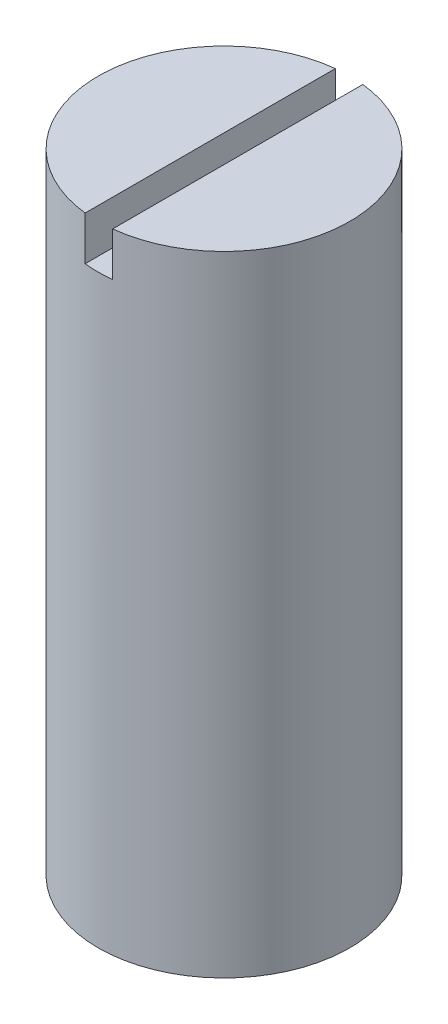
ISO-10303-21;
HEADER;
FILE_DESCRIPTION(('STEP AP214'),'2;1');
FILE_NAME('part.step','',(''),(''),'','','');
FILE_SCHEMA(('AUTOMOTIVE_DESIGN { 1 0 10303 214 1 1 1 1 }'));
ENDSEC;
DATA;
#1=APPLICATION_CONTEXT('core data for automotive mechanical design processes');
#2=APPLICATION_PROTOCOL_DEFINITION('international standard','automotive_design',2000,#1);
#3=PRODUCT_CONTEXT('',#1,'mechanical');
#4=PRODUCT('Part','Part','',(#3));
#5=PRODUCT_RELATED_PRODUCT_CATEGORY('part','',(#4));
#6=PRODUCT_DEFINITION_FORMATION('','',#4);
#7=PRODUCT_DEFINITION_CONTEXT('part definition',#1,'design');
#8=PRODUCT_DEFINITION('design','',#6,#7);
#9=PRODUCT_DEFINITION_SHAPE('','',#8);
#10=(LENGTH_UNIT() NAMED_UNIT(*) SI_UNIT(.MILLI.,.METRE.));
#11=(NAMED_UNIT(*) PLANE_ANGLE_UNIT() SI_UNIT($,.RADIAN.));
#12=(NAMED_UNIT(*) SI_UNIT($,.STERADIAN.) SOLID_ANGLE_UNIT());
#13=UNCERTAINTY_MEASURE_WITH_UNIT(LENGTH_MEASURE(1.E-05),#10,'distance_accuracy_value','');
#14=(GEOMETRIC_REPRESENTATION_CONTEXT(3) GLOBAL_UNCERTAINTY_ASSIGNED_CONTEXT((#13)) GLOBAL_UNIT_ASSIGNED_CONTEXT((#10,
#11,#12)) REPRESENTATION_CONTEXT('',''));
#15=CARTESIAN_POINT('',(0.,0.,0.));
#16=DIRECTION('',(0.,0.,1.));
#17=DIRECTION('',(1.,0.,0.));
#18=AXIS2_PLACEMENT_3D('',#15,#16,#17);
#19=CARTESIAN_POINT('',(0.,80.,0.));
#20=DIRECTION('',(0.,1.,0.));
#21=DIRECTION('',(0.,0.,1.));
#22=AXIS2_PLACEMENT_3D('',#19,#20,#21);
#23=PLANE('',#22);
#24=DIRECTION('',(0.,0.,1.));
#25=VECTOR('',#24,1.);
#26=CARTESIAN_POINT('',(-1.75,80.,0.));
#27=LINE('',#26,#25);
#28=CARTESIAN_POINT('',(-1.75,80.,-15.9040089285689));
#29=VERTEX_POINT('',#28);
#30=CARTESIAN_POINT('',(-1.75,80.,15.9040089285689));
#31=VERTEX_POINT('',#30);
#32=EDGE_CURVE('E65',#29,#31,#27,.T.);
#33=ORIENTED_EDGE('',*,*,#32,.F.);
#34=CARTESIAN_POINT('',(0.,80.,0.));
#35=DIRECTION('',(0.,1.,0.));
#36=DIRECTION('',(0.,0.,1.));
#37=AXIS2_PLACEMENT_3D('',#34,#35,#36);
#38=CIRCLE('',#37,16.);
#39=EDGE_CURVE('E110',#29,#31,#38,.T.);
#40=ORIENTED_EDGE('',*,*,#39,.T.);
#41=EDGE_LOOP('',(#33,#40));
#42=FACE_BOUND('',#41,.T.);
#43=ADVANCED_FACE('F41',(#42),#23,.T.);
#44=CARTESIAN_POINT('',(0.,80.,0.));
#45=DIRECTION('',(0.,-1.,0.));
#46=DIRECTION('',(0.,0.,-1.));
#47=AXIS2_PLACEMENT_3D('',#44,#45,#46);
#48=CYLINDRICAL_SURFACE('',#47,16.);
#49=CARTESIAN_POINT('',(0.,74.4125,0.));
#50=DIRECTION('',(0.,-1.,0.));
#51=DIRECTION('',(0.,0.,-1.));
#52=AXIS2_PLACEMENT_3D('',#49,#50,#51);
#53=CIRCLE('',#52,16.);
#54=CARTESIAN_POINT('',(1.75,74.4125,15.9040089285689));
#55=VERTEX_POINT('',#54);
#56=CARTESIAN_POINT('',(-1.75,74.4125,15.9040089285689));
#57=VERTEX_POINT('',#56);
#58=EDGE_CURVE('E11',#55,#57,#53,.T.);
#59=ORIENTED_EDGE('',*,*,#58,.T.);
#60=DIRECTION('',(0.,-1.,0.));
#61=VECTOR('',#60,1.);
#62=CARTESIAN_POINT('',(-1.75,80.,15.9040089285689));
#63=LINE('',#62,#61);
#64=EDGE_CURVE('E109',#57,#31,#63,.F.);
#65=ORIENTED_EDGE('',*,*,#64,.T.);
#66=ORIENTED_EDGE('',*,*,#39,.F.);
#67=DIRECTION('',(0.,-1.,0.));
#68=VECTOR('',#67,1.);
#69=CARTESIAN_POINT('',(-1.75,80.,-15.9040089285689));
#70=LINE('',#69,#68);
#71=CARTESIAN_POINT('',(-1.75,74.4125,-15.9040089285689));
#72=VERTEX_POINT('',#71);
#73=EDGE_CURVE('E99',#29,#72,#70,.T.);
#74=ORIENTED_EDGE('',*,*,#73,.T.);
#75=CARTESIAN_POINT('',(1.75,74.4125,-15.9040089285689));
#76=VERTEX_POINT('',#75);
#77=EDGE_CURVE('E44',#72,#76,#53,.T.);
#78=ORIENTED_EDGE('',*,*,#77,.T.);
#79=DIRECTION('',(0.,-1.,0.));
#80=VECTOR('',#79,1.);
#81=CARTESIAN_POINT('',(1.75,80.,-15.9040089285689));
#82=LINE('',#81,#80);
#83=CARTESIAN_POINT('',(1.75,80.,-15.9040089285689));
#84=VERTEX_POINT('',#83);
#85=EDGE_CURVE('E81',#76,#84,#82,.F.);
#86=ORIENTED_EDGE('',*,*,#85,.T.);
#87=CARTESIAN_POINT('',(1.75,80.,15.9040089285689));
#88=VERTEX_POINT('',#87);
#89=EDGE_CURVE('E101',#88,#84,#38,.T.);
#90=ORIENTED_EDGE('',*,*,#89,.F.);
#91=DIRECTION('',(0.,-1.,0.));
#92=VECTOR('',#91,1.);
#93=CARTESIAN_POINT('',(1.75,80.,15.9040089285689));
#94=LINE('',#93,#92);
#95=EDGE_CURVE('E57',#88,#55,#94,.T.);
#96=ORIENTED_EDGE('',*,*,#95,.T.);
#97=EDGE_LOOP('',(#59,#65,#66,#74,#78,#86,#90,#96));
#98=FACE_BOUND('',#97,.T.);
#99=CARTESIAN_POINT('',(0.,0.,0.));
#100=DIRECTION('',(0.,1.,0.));
#101=DIRECTION('',(0.,0.,1.));
#102=AXIS2_PLACEMENT_3D('',#99,#100,#101);
#103=CIRCLE('',#102,16.);
#104=CARTESIAN_POINT('',(0.,0.,16.));
#105=VERTEX_POINT('',#104);
#106=EDGE_CURVE('E102',#105,#105,#103,.T.);
#107=ORIENTED_EDGE('',*,*,#106,.T.);
#108=EDGE_LOOP('',(#107));
#109=FACE_BOUND('',#108,.T.);
#110=ADVANCED_FACE('F43',(#98,#109),#48,.T.);
#111=DIRECTION('',(0.,0.,-1.));
#112=VECTOR('',#111,1.);
#113=CARTESIAN_POINT('',(1.75,80.,0.));
#114=LINE('',#113,#112);
#115=EDGE_CURVE('E84',#88,#84,#114,.T.);
#116=ORIENTED_EDGE('',*,*,#115,.F.);
#117=ORIENTED_EDGE('',*,*,#89,.T.);
#118=EDGE_LOOP('',(#116,#117));
#119=FACE_BOUND('',#118,.T.);
#120=ADVANCED_FACE('F113',(#119),#23,.T.);
#121=CARTESIAN_POINT('',(0.,0.,0.));
#122=DIRECTION('',(0.,1.,0.));
#123=DIRECTION('',(0.,0.,1.));
#124=AXIS2_PLACEMENT_3D('',#121,#122,#123);
#125=PLANE('',#124);
#126=ORIENTED_EDGE('',*,*,#106,.F.);
#127=EDGE_LOOP('',(#126));
#128=FACE_BOUND('',#127,.T.);
#129=ADVANCED_FACE('F119',(#128),#125,.F.);
#130=CARTESIAN_POINT('',(-1.75,74.4125,-18.));
#131=DIRECTION('',(0.,-1.,0.));
#132=DIRECTION('',(0.,0.,-1.));
#133=AXIS2_PLACEMENT_3D('',#130,#131,#132);
#134=PLANE('',#133);
#135=DIRECTION('',(0.,0.,1.));
#136=VECTOR('',#135,1.);
#137=CARTESIAN_POINT('',(1.75,74.4125,-18.));
#138=LINE('',#137,#136);
#139=EDGE_CURVE('E82',#76,#55,#138,.T.);
#140=ORIENTED_EDGE('',*,*,#139,.F.);
#141=ORIENTED_EDGE('',*,*,#77,.F.);
#142=DIRECTION('',(0.,0.,1.));
#143=VECTOR('',#142,1.);
#144=CARTESIAN_POINT('',(-1.75,74.4125,-18.));
#145=LINE('',#144,#143);
#146=EDGE_CURVE('E92',#72,#57,#145,.T.);
#147=ORIENTED_EDGE('',*,*,#146,.T.);
#148=ORIENTED_EDGE('',*,*,#58,.F.);
#149=EDGE_LOOP('',(#140,#141,#147,#148));
#150=FACE_BOUND('',#149,.T.);
#151=ADVANCED_FACE('F95',(#150),#134,.F.);
#152=CARTESIAN_POINT('',(-1.75,82.,-18.));
#153=DIRECTION('',(-1.,0.,0.));
#154=DIRECTION('',(0.,0.,1.));
#155=AXIS2_PLACEMENT_3D('',#152,#153,#154);
#156=PLANE('',#155);
#157=ORIENTED_EDGE('',*,*,#32,.T.);
#158=ORIENTED_EDGE('',*,*,#64,.F.);
#159=ORIENTED_EDGE('',*,*,#146,.F.);
#160=ORIENTED_EDGE('',*,*,#73,.F.);
#161=EDGE_LOOP('',(#157,#158,#159,#160));
#162=FACE_BOUND('',#161,.T.);
#163=ADVANCED_FACE('F154',(#162),#156,.F.);
#164=CARTESIAN_POINT('',(1.75,74.4125,-18.));
#165=DIRECTION('',(1.,0.,0.));
#166=DIRECTION('',(0.,0.,-1.));
#167=AXIS2_PLACEMENT_3D('',#164,#165,#166);
#168=PLANE('',#167);
#169=ORIENTED_EDGE('',*,*,#115,.T.);
#170=ORIENTED_EDGE('',*,*,#85,.F.);
#171=ORIENTED_EDGE('',*,*,#139,.T.);
#172=ORIENTED_EDGE('',*,*,#95,.F.);
#173=EDGE_LOOP('',(#169,#170,#171,#172));
#174=FACE_BOUND('',#173,.T.);
#175=ADVANCED_FACE('F83',(#174),#168,.F.);
#176=CLOSED_SHELL('',(#43,#110,#120,#129,#151,#163,#175));
#177=MANIFOLD_SOLID_BREP('B2',#176);
#178=ADVANCED_BREP_SHAPE_REPRESENTATION('',(#18,#177),#14);
#179=SHAPE_DEFINITION_REPRESENTATION(#9,#178);
ENDSEC;
END-ISO-10303-21;
